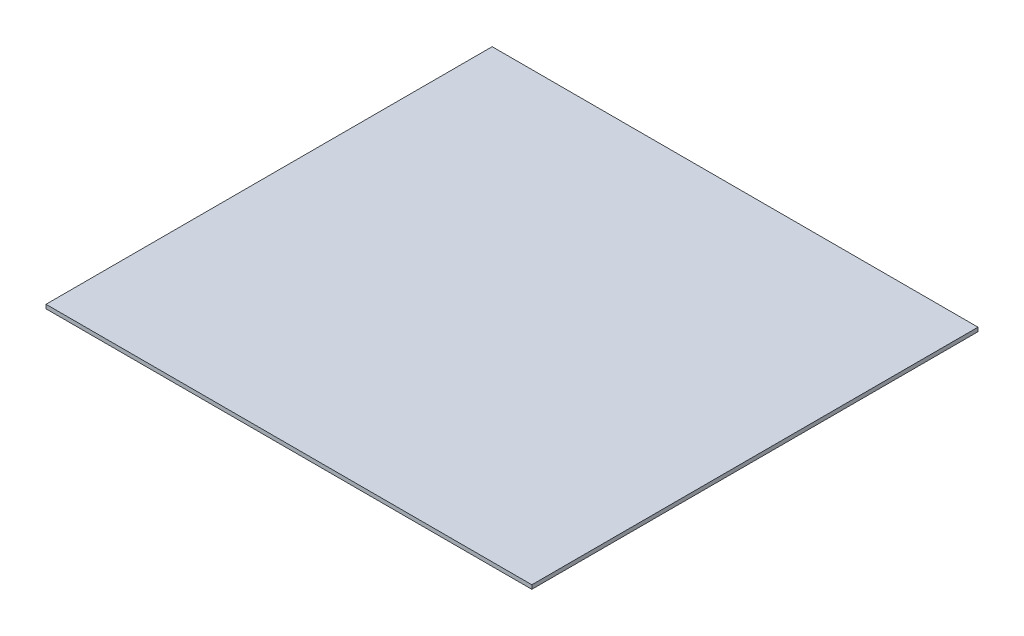
ISO-10303-21;
HEADER;
FILE_DESCRIPTION(('STEP AP214'),'2;1');
FILE_NAME('part.step','',(''),(''),'','','');
FILE_SCHEMA(('AUTOMOTIVE_DESIGN { 1 0 10303 214 1 1 1 1 }'));
ENDSEC;
DATA;
#1=APPLICATION_CONTEXT('core data for automotive mechanical design processes');
#2=APPLICATION_PROTOCOL_DEFINITION('international standard','automotive_design',2000,#1);
#3=PRODUCT_CONTEXT('',#1,'mechanical');
#4=PRODUCT('Part','Part','',(#3));
#5=PRODUCT_RELATED_PRODUCT_CATEGORY('part','',(#4));
#6=PRODUCT_DEFINITION_FORMATION('','',#4);
#7=PRODUCT_DEFINITION_CONTEXT('part definition',#1,'design');
#8=PRODUCT_DEFINITION('design','',#6,#7);
#9=PRODUCT_DEFINITION_SHAPE('','',#8);
#10=(LENGTH_UNIT() NAMED_UNIT(*) SI_UNIT(.MILLI.,.METRE.));
#11=(NAMED_UNIT(*) PLANE_ANGLE_UNIT() SI_UNIT($,.RADIAN.));
#12=(NAMED_UNIT(*) SI_UNIT($,.STERADIAN.) SOLID_ANGLE_UNIT());
#13=UNCERTAINTY_MEASURE_WITH_UNIT(LENGTH_MEASURE(1.E-05),#10,'distance_accuracy_value','');
#14=(GEOMETRIC_REPRESENTATION_CONTEXT(3) GLOBAL_UNCERTAINTY_ASSIGNED_CONTEXT((#13)) GLOBAL_UNIT_ASSIGNED_CONTEXT((#10,
#11,#12)) REPRESENTATION_CONTEXT('',''));
#15=CARTESIAN_POINT('',(0.,0.,0.));
#16=DIRECTION('',(0.,0.,1.));
#17=DIRECTION('',(1.,0.,0.));
#18=AXIS2_PLACEMENT_3D('',#15,#16,#17);
#19=CARTESIAN_POINT('',(245.,-4.,-225.));
#20=DIRECTION('',(1.,0.,0.));
#21=DIRECTION('',(0.,0.,-1.));
#22=AXIS2_PLACEMENT_3D('',#19,#20,#21);
#23=PLANE('',#22);
#24=DIRECTION('',(0.,0.,-1.));
#25=VECTOR('',#24,1.);
#26=CARTESIAN_POINT('',(245.,0.,-225.));
#27=LINE('',#26,#25);
#28=CARTESIAN_POINT('',(245.,0.,225.));
#29=VERTEX_POINT('',#28);
#30=CARTESIAN_POINT('',(245.,0.,-225.));
#31=VERTEX_POINT('',#30);
#32=EDGE_CURVE('E103',#29,#31,#27,.T.);
#33=ORIENTED_EDGE('',*,*,#32,.F.);
#34=DIRECTION('',(0.,1.,0.));
#35=VECTOR('',#34,1.);
#36=CARTESIAN_POINT('',(245.,-4.,225.));
#37=LINE('',#36,#35);
#38=CARTESIAN_POINT('',(245.,-4.,225.));
#39=VERTEX_POINT('',#38);
#40=EDGE_CURVE('E11',#39,#29,#37,.T.);
#41=ORIENTED_EDGE('',*,*,#40,.F.);
#42=DIRECTION('',(0.,0.,-1.));
#43=VECTOR('',#42,1.);
#44=CARTESIAN_POINT('',(245.,-4.,-225.));
#45=LINE('',#44,#43);
#46=CARTESIAN_POINT('',(245.,-4.,-225.));
#47=VERTEX_POINT('',#46);
#48=EDGE_CURVE('E97',#39,#47,#45,.T.);
#49=ORIENTED_EDGE('',*,*,#48,.T.);
#50=DIRECTION('',(0.,1.,0.));
#51=VECTOR('',#50,1.);
#52=CARTESIAN_POINT('',(245.,-4.,-225.));
#53=LINE('',#52,#51);
#54=EDGE_CURVE('E42',#47,#31,#53,.T.);
#55=ORIENTED_EDGE('',*,*,#54,.T.);
#56=EDGE_LOOP('',(#33,#41,#49,#55));
#57=FACE_BOUND('',#56,.T.);
#58=ADVANCED_FACE('F39',(#57),#23,.T.);
#59=CARTESIAN_POINT('',(-245.,-4.,225.));
#60=DIRECTION('',(0.,0.,1.));
#61=DIRECTION('',(1.,0.,0.));
#62=AXIS2_PLACEMENT_3D('',#59,#60,#61);
#63=PLANE('',#62);
#64=DIRECTION('',(1.,0.,0.));
#65=VECTOR('',#64,1.);
#66=CARTESIAN_POINT('',(-245.,0.,225.));
#67=LINE('',#66,#65);
#68=CARTESIAN_POINT('',(-245.,0.,225.));
#69=VERTEX_POINT('',#68);
#70=EDGE_CURVE('E99',#69,#29,#67,.T.);
#71=ORIENTED_EDGE('',*,*,#70,.F.);
#72=DIRECTION('',(0.,1.,0.));
#73=VECTOR('',#72,1.);
#74=CARTESIAN_POINT('',(-245.,-4.,225.));
#75=LINE('',#74,#73);
#76=CARTESIAN_POINT('',(-245.,-4.,225.));
#77=VERTEX_POINT('',#76);
#78=EDGE_CURVE('E48',#77,#69,#75,.T.);
#79=ORIENTED_EDGE('',*,*,#78,.F.);
#80=DIRECTION('',(1.,0.,0.));
#81=VECTOR('',#80,1.);
#82=CARTESIAN_POINT('',(-245.,-4.,225.));
#83=LINE('',#82,#81);
#84=EDGE_CURVE('E94',#77,#39,#83,.T.);
#85=ORIENTED_EDGE('',*,*,#84,.T.);
#86=ORIENTED_EDGE('',*,*,#40,.T.);
#87=EDGE_LOOP('',(#71,#79,#85,#86));
#88=FACE_BOUND('',#87,.T.);
#89=ADVANCED_FACE('F113',(#88),#63,.T.);
#90=CARTESIAN_POINT('',(-245.,-4.,-225.));
#91=DIRECTION('',(-1.,0.,0.));
#92=DIRECTION('',(0.,0.,1.));
#93=AXIS2_PLACEMENT_3D('',#90,#91,#92);
#94=PLANE('',#93);
#95=DIRECTION('',(0.,0.,1.));
#96=VECTOR('',#95,1.);
#97=CARTESIAN_POINT('',(-245.,0.,-225.));
#98=LINE('',#97,#96);
#99=CARTESIAN_POINT('',(-245.,0.,-225.));
#100=VERTEX_POINT('',#99);
#101=EDGE_CURVE('E89',#100,#69,#98,.T.);
#102=ORIENTED_EDGE('',*,*,#101,.F.);
#103=DIRECTION('',(0.,1.,0.));
#104=VECTOR('',#103,1.);
#105=CARTESIAN_POINT('',(-245.,-4.,-225.));
#106=LINE('',#105,#104);
#107=CARTESIAN_POINT('',(-245.,-4.,-225.));
#108=VERTEX_POINT('',#107);
#109=EDGE_CURVE('E84',#108,#100,#106,.T.);
#110=ORIENTED_EDGE('',*,*,#109,.F.);
#111=DIRECTION('',(0.,0.,1.));
#112=VECTOR('',#111,1.);
#113=CARTESIAN_POINT('',(-245.,-4.,-225.));
#114=LINE('',#113,#112);
#115=EDGE_CURVE('E87',#108,#77,#114,.T.);
#116=ORIENTED_EDGE('',*,*,#115,.T.);
#117=ORIENTED_EDGE('',*,*,#78,.T.);
#118=EDGE_LOOP('',(#102,#110,#116,#117));
#119=FACE_BOUND('',#118,.T.);
#120=ADVANCED_FACE('F86',(#119),#94,.T.);
#121=CARTESIAN_POINT('',(-245.,-4.,-225.));
#122=DIRECTION('',(0.,0.,-1.));
#123=DIRECTION('',(-1.,0.,0.));
#124=AXIS2_PLACEMENT_3D('',#121,#122,#123);
#125=PLANE('',#124);
#126=DIRECTION('',(-1.,0.,0.));
#127=VECTOR('',#126,1.);
#128=CARTESIAN_POINT('',(-245.,0.,-225.));
#129=LINE('',#128,#127);
#130=EDGE_CURVE('E106',#31,#100,#129,.T.);
#131=ORIENTED_EDGE('',*,*,#130,.F.);
#132=ORIENTED_EDGE('',*,*,#54,.F.);
#133=DIRECTION('',(-1.,0.,0.));
#134=VECTOR('',#133,1.);
#135=CARTESIAN_POINT('',(-245.,-4.,-225.));
#136=LINE('',#135,#134);
#137=EDGE_CURVE('E93',#47,#108,#136,.T.);
#138=ORIENTED_EDGE('',*,*,#137,.T.);
#139=ORIENTED_EDGE('',*,*,#109,.T.);
#140=EDGE_LOOP('',(#131,#132,#138,#139));
#141=FACE_BOUND('',#140,.T.);
#142=ADVANCED_FACE('F96',(#141),#125,.T.);
#143=CARTESIAN_POINT('',(0.,-4.,0.));
#144=DIRECTION('',(0.,1.,0.));
#145=DIRECTION('',(0.,0.,1.));
#146=AXIS2_PLACEMENT_3D('',#143,#144,#145);
#147=PLANE('',#146);
#148=ORIENTED_EDGE('',*,*,#48,.F.);
#149=ORIENTED_EDGE('',*,*,#84,.F.);
#150=ORIENTED_EDGE('',*,*,#115,.F.);
#151=ORIENTED_EDGE('',*,*,#137,.F.);
#152=EDGE_LOOP('',(#148,#149,#150,#151));
#153=FACE_BOUND('',#152,.T.);
#154=ADVANCED_FACE('F92',(#153),#147,.F.);
#155=CARTESIAN_POINT('',(0.,0.,0.));
#156=DIRECTION('',(0.,1.,0.));
#157=DIRECTION('',(0.,0.,1.));
#158=AXIS2_PLACEMENT_3D('',#155,#156,#157);
#159=PLANE('',#158);
#160=ORIENTED_EDGE('',*,*,#32,.T.);
#161=ORIENTED_EDGE('',*,*,#130,.T.);
#162=ORIENTED_EDGE('',*,*,#101,.T.);
#163=ORIENTED_EDGE('',*,*,#70,.T.);
#164=EDGE_LOOP('',(#160,#161,#162,#163));
#165=FACE_BOUND('',#164,.T.);
#166=ADVANCED_FACE('F112',(#165),#159,.T.);
#167=CLOSED_SHELL('',(#58,#89,#120,#142,#154,#166));
#168=MANIFOLD_SOLID_BREP('B2',#167);
#169=ADVANCED_BREP_SHAPE_REPRESENTATION('',(#18,#168),#14);
#170=SHAPE_DEFINITION_REPRESENTATION(#9,#169);
ENDSEC;
END-ISO-10303-21;
